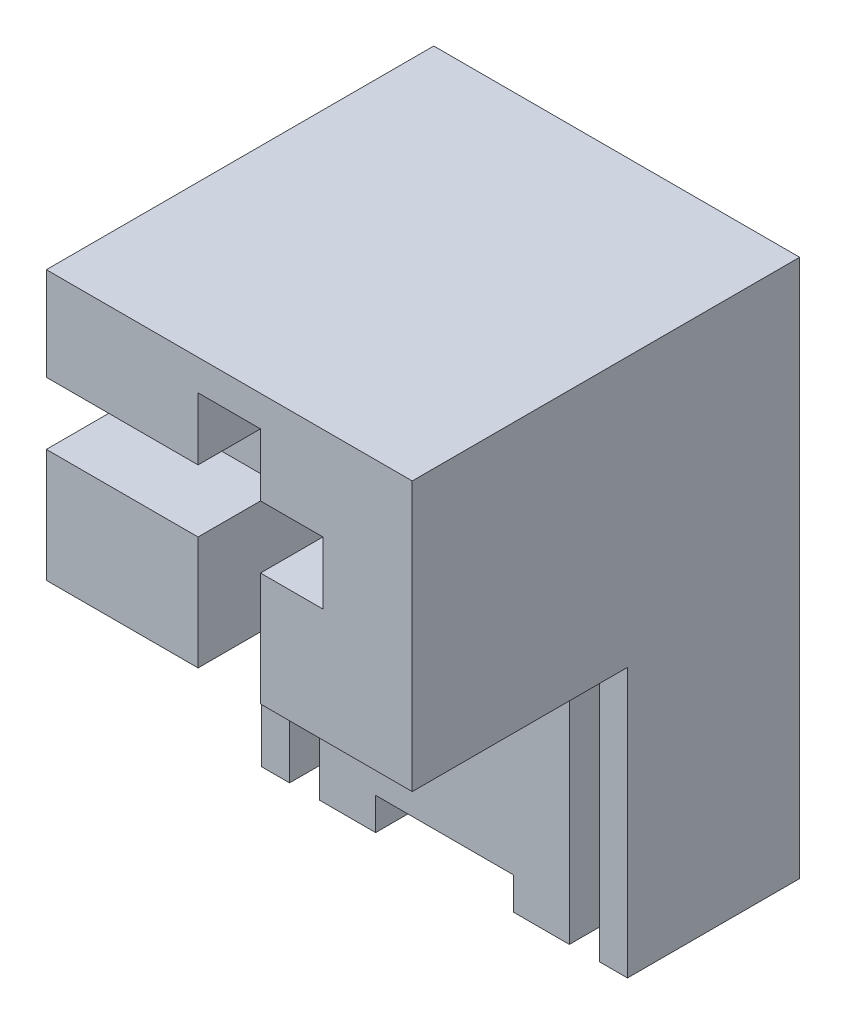
ISO-10303-21;
HEADER;
FILE_DESCRIPTION(('STEP AP214'),'2;1');
FILE_NAME('part.step','',(''),(''),'','','');
FILE_SCHEMA(('AUTOMOTIVE_DESIGN { 1 0 10303 214 1 1 1 1 }'));
ENDSEC;
DATA;
#1=APPLICATION_CONTEXT('core data for automotive mechanical design processes');
#2=APPLICATION_PROTOCOL_DEFINITION('international standard','automotive_design',2000,#1);
#3=PRODUCT_CONTEXT('',#1,'mechanical');
#4=PRODUCT('Part','Part','',(#3));
#5=PRODUCT_RELATED_PRODUCT_CATEGORY('part','',(#4));
#6=PRODUCT_DEFINITION_FORMATION('','',#4);
#7=PRODUCT_DEFINITION_CONTEXT('part definition',#1,'design');
#8=PRODUCT_DEFINITION('design','',#6,#7);
#9=PRODUCT_DEFINITION_SHAPE('','',#8);
#10=(LENGTH_UNIT() NAMED_UNIT(*) SI_UNIT(.MILLI.,.METRE.));
#11=(NAMED_UNIT(*) PLANE_ANGLE_UNIT() SI_UNIT($,.RADIAN.));
#12=(NAMED_UNIT(*) SI_UNIT($,.STERADIAN.) SOLID_ANGLE_UNIT());
#13=UNCERTAINTY_MEASURE_WITH_UNIT(LENGTH_MEASURE(1.E-05),#10,'distance_accuracy_value','');
#14=(GEOMETRIC_REPRESENTATION_CONTEXT(3) GLOBAL_UNCERTAINTY_ASSIGNED_CONTEXT((#13)) GLOBAL_UNIT_ASSIGNED_CONTEXT((#10,
#11,#12)) REPRESENTATION_CONTEXT('',''));
#15=CARTESIAN_POINT('',(0.,0.,0.));
#16=DIRECTION('',(0.,0.,1.));
#17=DIRECTION('',(1.,0.,0.));
#18=AXIS2_PLACEMENT_3D('',#15,#16,#17);
#19=CARTESIAN_POINT('',(0.,0.,90.));
#20=DIRECTION('',(0.,-1.,0.));
#21=DIRECTION('',(1.,0.,0.));
#22=AXIS2_PLACEMENT_3D('',#19,#20,#21);
#23=PLANE('',#22);
#24=DIRECTION('',(1.,0.,0.));
#25=VECTOR('',#24,1.);
#26=CARTESIAN_POINT('',(0.,0.,40.));
#27=LINE('',#26,#25);
#28=CARTESIAN_POINT('',(-29.,0.,40.));
#29=VERTEX_POINT('',#28);
#30=CARTESIAN_POINT('',(-7.24999999999998,0.,40.));
#31=VERTEX_POINT('',#30);
#32=EDGE_CURVE('E437',#29,#31,#27,.T.);
#33=ORIENTED_EDGE('',*,*,#32,.T.);
#34=DIRECTION('',(0.,0.,-1.));
#35=VECTOR('',#34,1.);
#36=CARTESIAN_POINT('',(-7.24999999999999,0.,90.));
#37=LINE('',#36,#35);
#38=CARTESIAN_POINT('',(-7.24999999999999,0.,90.));
#39=VERTEX_POINT('',#38);
#40=EDGE_CURVE('E98',#39,#31,#37,.T.);
#41=ORIENTED_EDGE('',*,*,#40,.F.);
#42=DIRECTION('',(-1.,0.,0.));
#43=VECTOR('',#42,1.);
#44=CARTESIAN_POINT('',(0.,0.,90.));
#45=LINE('',#44,#43);
#46=CARTESIAN_POINT('',(-42.5,0.,90.));
#47=VERTEX_POINT('',#46);
#48=EDGE_CURVE('E357',#39,#47,#45,.T.);
#49=ORIENTED_EDGE('',*,*,#48,.T.);
#50=DIRECTION('',(0.,0.,-1.));
#51=VECTOR('',#50,1.);
#52=CARTESIAN_POINT('',(-42.5,0.,90.));
#53=LINE('',#52,#51);
#54=CARTESIAN_POINT('',(-42.5,0.,40.));
#55=VERTEX_POINT('',#54);
#56=EDGE_CURVE('E91',#47,#55,#53,.T.);
#57=ORIENTED_EDGE('',*,*,#56,.T.);
#58=DIRECTION('',(-1.,0.,0.));
#59=VECTOR('',#58,1.);
#60=CARTESIAN_POINT('',(0.,0.,40.));
#61=LINE('',#60,#59);
#62=CARTESIAN_POINT('',(-36.,0.,40.));
#63=VERTEX_POINT('',#62);
#64=EDGE_CURVE('E373',#63,#55,#61,.T.);
#65=ORIENTED_EDGE('',*,*,#64,.F.);
#66=DIRECTION('',(0.,0.,-1.));
#67=VECTOR('',#66,1.);
#68=CARTESIAN_POINT('',(-36.,0.,40.));
#69=LINE('',#68,#67);
#70=CARTESIAN_POINT('',(-36.,0.,0.));
#71=VERTEX_POINT('',#70);
#72=EDGE_CURVE('E403',#63,#71,#69,.T.);
#73=ORIENTED_EDGE('',*,*,#72,.T.);
#74=DIRECTION('',(-1.,0.,0.));
#75=VECTOR('',#74,1.);
#76=CARTESIAN_POINT('',(0.,0.,0.));
#77=LINE('',#76,#75);
#78=CARTESIAN_POINT('',(-29.,0.,0.));
#79=VERTEX_POINT('',#78);
#80=EDGE_CURVE('E364',#79,#71,#77,.T.);
#81=ORIENTED_EDGE('',*,*,#80,.F.);
#82=DIRECTION('',(0.,0.,-1.));
#83=VECTOR('',#82,1.);
#84=CARTESIAN_POINT('',(-29.,0.,40.));
#85=LINE('',#84,#83);
#86=EDGE_CURVE('E484',#29,#79,#85,.T.);
#87=ORIENTED_EDGE('',*,*,#86,.F.);
#88=EDGE_LOOP('',(#33,#41,#49,#57,#65,#73,#81,#87));
#89=FACE_BOUND('',#88,.T.);
#90=ADVANCED_FACE('F83',(#89),#23,.T.);
#91=DIRECTION('',(0.,0.,-1.));
#92=VECTOR('',#91,1.);
#93=CARTESIAN_POINT('',(7.25000000000001,0.,90.));
#94=LINE('',#93,#92);
#95=CARTESIAN_POINT('',(7.25000000000001,0.,90.));
#96=VERTEX_POINT('',#95);
#97=CARTESIAN_POINT('',(7.25000000000001,0.,40.));
#98=VERTEX_POINT('',#97);
#99=EDGE_CURVE('E320',#96,#98,#94,.T.);
#100=ORIENTED_EDGE('',*,*,#99,.T.);
#101=CARTESIAN_POINT('',(29.,0.,40.));
#102=VERTEX_POINT('',#101);
#103=EDGE_CURVE('E440',#98,#102,#27,.T.);
#104=ORIENTED_EDGE('',*,*,#103,.T.);
#105=DIRECTION('',(0.,0.,-1.));
#106=VECTOR('',#105,1.);
#107=CARTESIAN_POINT('',(29.,0.,40.));
#108=LINE('',#107,#106);
#109=CARTESIAN_POINT('',(29.,0.,0.));
#110=VERTEX_POINT('',#109);
#111=EDGE_CURVE('E458',#102,#110,#108,.T.);
#112=ORIENTED_EDGE('',*,*,#111,.T.);
#113=CARTESIAN_POINT('',(36.,0.,0.));
#114=VERTEX_POINT('',#113);
#115=EDGE_CURVE('E106',#114,#110,#77,.T.);
#116=ORIENTED_EDGE('',*,*,#115,.F.);
#117=DIRECTION('',(0.,0.,-1.));
#118=VECTOR('',#117,1.);
#119=CARTESIAN_POINT('',(36.,0.,40.));
#120=LINE('',#119,#118);
#121=CARTESIAN_POINT('',(36.,0.,40.));
#122=VERTEX_POINT('',#121);
#123=EDGE_CURVE('E425',#122,#114,#120,.T.);
#124=ORIENTED_EDGE('',*,*,#123,.F.);
#125=DIRECTION('',(-1.,0.,0.));
#126=VECTOR('',#125,1.);
#127=CARTESIAN_POINT('',(0.,0.,40.));
#128=LINE('',#127,#126);
#129=CARTESIAN_POINT('',(42.5,0.,40.));
#130=VERTEX_POINT('',#129);
#131=EDGE_CURVE('E406',#130,#122,#128,.T.);
#132=ORIENTED_EDGE('',*,*,#131,.F.);
#133=DIRECTION('',(0.,0.,-1.));
#134=VECTOR('',#133,1.);
#135=CARTESIAN_POINT('',(42.5,0.,90.));
#136=LINE('',#135,#134);
#137=CARTESIAN_POINT('',(42.5,0.,90.));
#138=VERTEX_POINT('',#137);
#139=EDGE_CURVE('E525',#138,#130,#136,.T.);
#140=ORIENTED_EDGE('',*,*,#139,.F.);
#141=DIRECTION('',(-1.,0.,0.));
#142=VECTOR('',#141,1.);
#143=CARTESIAN_POINT('',(0.,0.,90.));
#144=LINE('',#143,#142);
#145=EDGE_CURVE('E514',#138,#96,#144,.T.);
#146=ORIENTED_EDGE('',*,*,#145,.T.);
#147=EDGE_LOOP('',(#100,#104,#112,#116,#124,#132,#140,#146));
#148=FACE_BOUND('',#147,.T.);
#149=ADVANCED_FACE('F609',(#148),#23,.T.);
#150=CARTESIAN_POINT('',(0.,26.349803871416,90.));
#151=DIRECTION('',(0.,1.,0.));
#152=DIRECTION('',(0.,0.,1.));
#153=AXIS2_PLACEMENT_3D('',#150,#151,#152);
#154=PLANE('',#153);
#155=DIRECTION('',(1.,0.,0.));
#156=VECTOR('',#155,1.);
#157=CARTESIAN_POINT('',(0.,26.349803871416,70.));
#158=LINE('',#157,#156);
#159=CARTESIAN_POINT('',(-42.5,26.349803871416,70.));
#160=VERTEX_POINT('',#159);
#161=CARTESIAN_POINT('',(-7.24999999999998,26.349803871416,70.));
#162=VERTEX_POINT('',#161);
#163=EDGE_CURVE('E309',#160,#162,#158,.T.);
#164=ORIENTED_EDGE('',*,*,#163,.F.);
#165=DIRECTION('',(0.,0.,-1.));
#166=VECTOR('',#165,1.);
#167=CARTESIAN_POINT('',(-42.5,26.349803871416,90.));
#168=LINE('',#167,#166);
#169=CARTESIAN_POINT('',(-42.5,26.349803871416,90.));
#170=VERTEX_POINT('',#169);
#171=EDGE_CURVE('E12',#170,#160,#168,.T.);
#172=ORIENTED_EDGE('',*,*,#171,.F.);
#173=DIRECTION('',(1.,0.,0.));
#174=VECTOR('',#173,1.);
#175=CARTESIAN_POINT('',(0.,26.349803871416,90.));
#176=LINE('',#175,#174);
#177=CARTESIAN_POINT('',(-7.24999999999998,26.349803871416,90.));
#178=VERTEX_POINT('',#177);
#179=EDGE_CURVE('E352',#170,#178,#176,.T.);
#180=ORIENTED_EDGE('',*,*,#179,.T.);
#181=DIRECTION('',(0.,0.,-1.));
#182=VECTOR('',#181,1.);
#183=CARTESIAN_POINT('',(-7.24999999999998,26.349803871416,90.));
#184=LINE('',#183,#182);
#185=EDGE_CURVE('E362',#178,#162,#184,.T.);
#186=ORIENTED_EDGE('',*,*,#185,.T.);
#187=EDGE_LOOP('',(#164,#172,#180,#186));
#188=FACE_BOUND('',#187,.T.);
#189=ADVANCED_FACE('F85',(#188),#154,.T.);
#190=CARTESIAN_POINT('',(-42.5,0.,90.));
#191=DIRECTION('',(1.,0.,0.));
#192=DIRECTION('',(0.,0.,-1.));
#193=AXIS2_PLACEMENT_3D('',#190,#191,#192);
#194=PLANE('',#193);
#195=DIRECTION('',(0.,-1.,0.));
#196=VECTOR('',#195,1.);
#197=CARTESIAN_POINT('',(-42.5,0.,0.));
#198=LINE('',#197,#196);
#199=CARTESIAN_POINT('',(-42.5,62.5,0.));
#200=VERTEX_POINT('',#199);
#201=CARTESIAN_POINT('',(-42.5,-62.5,0.));
#202=VERTEX_POINT('',#201);
#203=EDGE_CURVE('E351',#200,#202,#198,.T.);
#204=ORIENTED_EDGE('',*,*,#203,.T.);
#205=DIRECTION('',(0.,0.,-1.));
#206=VECTOR('',#205,1.);
#207=CARTESIAN_POINT('',(-42.5,-62.5,40.));
#208=LINE('',#207,#206);
#209=CARTESIAN_POINT('',(-42.5,-62.5,40.));
#210=VERTEX_POINT('',#209);
#211=EDGE_CURVE('E383',#210,#202,#208,.T.);
#212=ORIENTED_EDGE('',*,*,#211,.F.);
#213=DIRECTION('',(0.,-1.,0.));
#214=VECTOR('',#213,1.);
#215=CARTESIAN_POINT('',(-42.5,0.,40.));
#216=LINE('',#215,#214);
#217=EDGE_CURVE('E381',#55,#210,#216,.T.);
#218=ORIENTED_EDGE('',*,*,#217,.F.);
#219=ORIENTED_EDGE('',*,*,#56,.F.);
#220=DIRECTION('',(0.,-1.,0.));
#221=VECTOR('',#220,1.);
#222=CARTESIAN_POINT('',(-42.5,0.,90.));
#223=LINE('',#222,#221);
#224=EDGE_CURVE('E355',#170,#47,#223,.T.);
#225=ORIENTED_EDGE('',*,*,#224,.F.);
#226=ORIENTED_EDGE('',*,*,#171,.T.);
#227=DIRECTION('',(0.,-1.,0.));
#228=VECTOR('',#227,1.);
#229=CARTESIAN_POINT('',(-42.5,0.,70.));
#230=LINE('',#229,#228);
#231=CARTESIAN_POINT('',(-42.5,40.849803871416,70.));
#232=VERTEX_POINT('',#231);
#233=EDGE_CURVE('E348',#232,#160,#230,.T.);
#234=ORIENTED_EDGE('',*,*,#233,.F.);
#235=DIRECTION('',(0.,0.,-1.));
#236=VECTOR('',#235,1.);
#237=CARTESIAN_POINT('',(-42.5,40.849803871416,90.));
#238=LINE('',#237,#236);
#239=CARTESIAN_POINT('',(-42.5,40.849803871416,90.));
#240=VERTEX_POINT('',#239);
#241=EDGE_CURVE('E330',#240,#232,#238,.T.);
#242=ORIENTED_EDGE('',*,*,#241,.F.);
#243=DIRECTION('',(0.,-1.,0.));
#244=VECTOR('',#243,1.);
#245=CARTESIAN_POINT('',(-42.5,0.,90.));
#246=LINE('',#245,#244);
#247=CARTESIAN_POINT('',(-42.5,62.5,90.));
#248=VERTEX_POINT('',#247);
#249=EDGE_CURVE('E490',#248,#240,#246,.T.);
#250=ORIENTED_EDGE('',*,*,#249,.F.);
#251=DIRECTION('',(0.,0.,-1.));
#252=VECTOR('',#251,1.);
#253=CARTESIAN_POINT('',(-42.5,62.5,90.));
#254=LINE('',#253,#252);
#255=EDGE_CURVE('E325',#248,#200,#254,.T.);
#256=ORIENTED_EDGE('',*,*,#255,.T.);
#257=EDGE_LOOP('',(#204,#212,#218,#219,#225,#226,#234,#242,#250,#256));
#258=FACE_BOUND('',#257,.T.);
#259=ADVANCED_FACE('F378',(#258),#194,.F.);
#260=CARTESIAN_POINT('',(-7.24999999999999,0.,90.));
#261=DIRECTION('',(-1.,0.,0.));
#262=DIRECTION('',(0.,-1.,0.));
#263=AXIS2_PLACEMENT_3D('',#260,#261,#262);
#264=PLANE('',#263);
#265=ORIENTED_EDGE('',*,*,#40,.T.);
#266=DIRECTION('',(0.,1.,0.));
#267=VECTOR('',#266,1.);
#268=CARTESIAN_POINT('',(-7.24999999999998,26.349803871416,40.));
#269=LINE('',#268,#267);
#270=CARTESIAN_POINT('',(-7.24999999999998,26.349803871416,40.));
#271=VERTEX_POINT('',#270);
#272=EDGE_CURVE('E398',#31,#271,#269,.T.);
#273=ORIENTED_EDGE('',*,*,#272,.T.);
#274=DIRECTION('',(0.,0.,1.));
#275=VECTOR('',#274,1.);
#276=CARTESIAN_POINT('',(-7.24999999999998,26.349803871416,9.92406004690646));
#277=LINE('',#276,#275);
#278=EDGE_CURVE('E299',#271,#162,#277,.T.);
#279=ORIENTED_EDGE('',*,*,#278,.T.);
#280=ORIENTED_EDGE('',*,*,#185,.F.);
#281=DIRECTION('',(0.,1.,0.));
#282=VECTOR('',#281,1.);
#283=CARTESIAN_POINT('',(-7.24999999999999,0.,90.));
#284=LINE('',#283,#282);
#285=EDGE_CURVE('E360',#39,#178,#284,.T.);
#286=ORIENTED_EDGE('',*,*,#285,.F.);
#287=EDGE_LOOP('',(#265,#273,#279,#280,#286));
#288=FACE_BOUND('',#287,.T.);
#289=ADVANCED_FACE('F551',(#288),#264,.F.);
#290=CARTESIAN_POINT('',(0.,0.,90.));
#291=DIRECTION('',(0.,0.,1.));
#292=DIRECTION('',(1.,0.,0.));
#293=AXIS2_PLACEMENT_3D('',#290,#291,#292);
#294=PLANE('',#293);
#295=ORIENTED_EDGE('',*,*,#179,.F.);
#296=ORIENTED_EDGE('',*,*,#224,.T.);
#297=ORIENTED_EDGE('',*,*,#48,.F.);
#298=ORIENTED_EDGE('',*,*,#285,.T.);
#299=EDGE_LOOP('',(#295,#296,#297,#298));
#300=FACE_BOUND('',#299,.T.);
#301=ADVANCED_FACE('F652',(#300),#294,.T.);
#302=CARTESIAN_POINT('',(0.,0.,0.));
#303=DIRECTION('',(0.,0.,1.));
#304=DIRECTION('',(1.,0.,0.));
#305=AXIS2_PLACEMENT_3D('',#302,#303,#304);
#306=PLANE('',#305);
#307=DIRECTION('',(0.,-1.,0.));
#308=VECTOR('',#307,1.);
#309=CARTESIAN_POINT('',(29.,0.,0.));
#310=LINE('',#309,#308);
#311=CARTESIAN_POINT('',(29.,-62.5,0.));
#312=VERTEX_POINT('',#311);
#313=EDGE_CURVE('E462',#110,#312,#310,.T.);
#314=ORIENTED_EDGE('',*,*,#313,.T.);
#315=DIRECTION('',(1.,0.,0.));
#316=VECTOR('',#315,1.);
#317=CARTESIAN_POINT('',(0.,-62.5,0.));
#318=LINE('',#317,#316);
#319=CARTESIAN_POINT('',(-29.,-62.5,0.));
#320=VERTEX_POINT('',#319);
#321=EDGE_CURVE('E460',#320,#312,#318,.T.);
#322=ORIENTED_EDGE('',*,*,#321,.F.);
#323=DIRECTION('',(0.,-1.,0.));
#324=VECTOR('',#323,1.);
#325=CARTESIAN_POINT('',(-29.,0.,0.));
#326=LINE('',#325,#324);
#327=EDGE_CURVE('E436',#79,#320,#326,.T.);
#328=ORIENTED_EDGE('',*,*,#327,.F.);
#329=ORIENTED_EDGE('',*,*,#80,.T.);
#330=DIRECTION('',(0.,-1.,0.));
#331=VECTOR('',#330,1.);
#332=CARTESIAN_POINT('',(-36.,0.,0.));
#333=LINE('',#332,#331);
#334=CARTESIAN_POINT('',(-36.,-62.5,0.));
#335=VERTEX_POINT('',#334);
#336=EDGE_CURVE('E394',#71,#335,#333,.T.);
#337=ORIENTED_EDGE('',*,*,#336,.T.);
#338=DIRECTION('',(1.,0.,0.));
#339=VECTOR('',#338,1.);
#340=CARTESIAN_POINT('',(0.,-62.5,0.));
#341=LINE('',#340,#339);
#342=EDGE_CURVE('E397',#202,#335,#341,.T.);
#343=ORIENTED_EDGE('',*,*,#342,.F.);
#344=ORIENTED_EDGE('',*,*,#203,.F.);
#345=DIRECTION('',(-1.,0.,0.));
#346=VECTOR('',#345,1.);
#347=CARTESIAN_POINT('',(0.,62.5,0.));
#348=LINE('',#347,#346);
#349=CARTESIAN_POINT('',(42.5,62.5,0.));
#350=VERTEX_POINT('',#349);
#351=EDGE_CURVE('E486',#350,#200,#348,.T.);
#352=ORIENTED_EDGE('',*,*,#351,.F.);
#353=DIRECTION('',(0.,1.,0.));
#354=VECTOR('',#353,1.);
#355=CARTESIAN_POINT('',(42.5,0.,0.));
#356=LINE('',#355,#354);
#357=CARTESIAN_POINT('',(42.5,-62.5,0.));
#358=VERTEX_POINT('',#357);
#359=EDGE_CURVE('E491',#358,#350,#356,.T.);
#360=ORIENTED_EDGE('',*,*,#359,.F.);
#361=DIRECTION('',(1.,0.,0.));
#362=VECTOR('',#361,1.);
#363=CARTESIAN_POINT('',(0.,-62.5,0.));
#364=LINE('',#363,#362);
#365=CARTESIAN_POINT('',(36.,-62.5,0.));
#366=VERTEX_POINT('',#365);
#367=EDGE_CURVE('E410',#366,#358,#364,.T.);
#368=ORIENTED_EDGE('',*,*,#367,.F.);
#369=DIRECTION('',(0.,-1.,0.));
#370=VECTOR('',#369,1.);
#371=CARTESIAN_POINT('',(36.,0.,0.));
#372=LINE('',#371,#370);
#373=EDGE_CURVE('E405',#114,#366,#372,.T.);
#374=ORIENTED_EDGE('',*,*,#373,.F.);
#375=ORIENTED_EDGE('',*,*,#115,.T.);
#376=EDGE_LOOP('',(#314,#322,#328,#329,#337,#343,#344,#352,#360,#368,#374,#375));
#377=FACE_BOUND('',#376,.T.);
#378=ADVANCED_FACE('F566',(#377),#306,.F.);
#379=CARTESIAN_POINT('',(0.,0.,70.));
#380=DIRECTION('',(0.,0.,1.));
#381=DIRECTION('',(1.,0.,0.));
#382=AXIS2_PLACEMENT_3D('',#379,#380,#381);
#383=PLANE('',#382);
#384=DIRECTION('',(-1.,0.,0.));
#385=VECTOR('',#384,1.);
#386=CARTESIAN_POINT('',(-7.24999999999998,26.349803871416,70.));
#387=LINE('',#386,#385);
#388=CARTESIAN_POINT('',(7.25000000000001,26.349803871416,70.));
#389=VERTEX_POINT('',#388);
#390=EDGE_CURVE('E291',#389,#162,#387,.T.);
#391=ORIENTED_EDGE('',*,*,#390,.F.);
#392=DIRECTION('',(1.,0.,0.));
#393=VECTOR('',#392,1.);
#394=CARTESIAN_POINT('',(0.,26.349803871416,70.));
#395=LINE('',#394,#393);
#396=CARTESIAN_POINT('',(21.75,26.349803871416,70.));
#397=VERTEX_POINT('',#396);
#398=EDGE_CURVE('E307',#389,#397,#395,.T.);
#399=ORIENTED_EDGE('',*,*,#398,.T.);
#400=DIRECTION('',(0.,1.,0.));
#401=VECTOR('',#400,1.);
#402=CARTESIAN_POINT('',(21.75,0.,70.));
#403=LINE('',#402,#401);
#404=CARTESIAN_POINT('',(21.75,40.849803871416,70.));
#405=VERTEX_POINT('',#404);
#406=EDGE_CURVE('E324',#397,#405,#403,.T.);
#407=ORIENTED_EDGE('',*,*,#406,.T.);
#408=DIRECTION('',(-1.,0.,0.));
#409=VECTOR('',#408,1.);
#410=CARTESIAN_POINT('',(0.,40.849803871416,70.));
#411=LINE('',#410,#409);
#412=CARTESIAN_POINT('',(7.25000000000001,40.849803871416,70.));
#413=VERTEX_POINT('',#412);
#414=EDGE_CURVE('E327',#405,#413,#411,.T.);
#415=ORIENTED_EDGE('',*,*,#414,.T.);
#416=DIRECTION('',(0.,1.,0.));
#417=VECTOR('',#416,1.);
#418=CARTESIAN_POINT('',(7.25000000000001,0.,70.));
#419=LINE('',#418,#417);
#420=CARTESIAN_POINT('',(7.25000000000001,55.349803871416,70.));
#421=VERTEX_POINT('',#420);
#422=EDGE_CURVE('E336',#413,#421,#419,.T.);
#423=ORIENTED_EDGE('',*,*,#422,.T.);
#424=DIRECTION('',(-1.,0.,0.));
#425=VECTOR('',#424,1.);
#426=CARTESIAN_POINT('',(0.,55.349803871416,70.));
#427=LINE('',#426,#425);
#428=CARTESIAN_POINT('',(-7.24999999999999,55.349803871416,70.));
#429=VERTEX_POINT('',#428);
#430=EDGE_CURVE('E339',#421,#429,#427,.T.);
#431=ORIENTED_EDGE('',*,*,#430,.T.);
#432=DIRECTION('',(0.,-1.,0.));
#433=VECTOR('',#432,1.);
#434=CARTESIAN_POINT('',(-7.24999999999998,0.,70.));
#435=LINE('',#434,#433);
#436=CARTESIAN_POINT('',(-7.24999999999998,40.849803871416,70.));
#437=VERTEX_POINT('',#436);
#438=EDGE_CURVE('E342',#429,#437,#435,.T.);
#439=ORIENTED_EDGE('',*,*,#438,.T.);
#440=DIRECTION('',(-1.,0.,0.));
#441=VECTOR('',#440,1.);
#442=CARTESIAN_POINT('',(0.,40.849803871416,70.));
#443=LINE('',#442,#441);
#444=EDGE_CURVE('E345',#437,#232,#443,.T.);
#445=ORIENTED_EDGE('',*,*,#444,.T.);
#446=ORIENTED_EDGE('',*,*,#233,.T.);
#447=ORIENTED_EDGE('',*,*,#163,.T.);
#448=EDGE_LOOP('',(#391,#399,#407,#415,#423,#431,#439,#445,#446,#447));
#449=FACE_BOUND('',#448,.T.);
#450=ADVANCED_FACE('F304',(#449),#383,.T.);
#451=CARTESIAN_POINT('',(0.,62.5,90.));
#452=DIRECTION('',(0.,-1.,0.));
#453=DIRECTION('',(0.,0.,-1.));
#454=AXIS2_PLACEMENT_3D('',#451,#452,#453);
#455=PLANE('',#454);
#456=ORIENTED_EDGE('',*,*,#351,.T.);
#457=ORIENTED_EDGE('',*,*,#255,.F.);
#458=DIRECTION('',(-1.,0.,0.));
#459=VECTOR('',#458,1.);
#460=CARTESIAN_POINT('',(0.,62.5,90.));
#461=LINE('',#460,#459);
#462=CARTESIAN_POINT('',(42.5,62.5,90.));
#463=VERTEX_POINT('',#462);
#464=EDGE_CURVE('E487',#463,#248,#461,.T.);
#465=ORIENTED_EDGE('',*,*,#464,.F.);
#466=DIRECTION('',(0.,0.,-1.));
#467=VECTOR('',#466,1.);
#468=CARTESIAN_POINT('',(42.5,62.5,90.));
#469=LINE('',#468,#467);
#470=EDGE_CURVE('E519',#463,#350,#469,.T.);
#471=ORIENTED_EDGE('',*,*,#470,.T.);
#472=EDGE_LOOP('',(#456,#457,#465,#471));
#473=FACE_BOUND('',#472,.T.);
#474=ADVANCED_FACE('F620',(#473),#455,.F.);
#475=CARTESIAN_POINT('',(0.,40.849803871416,90.));
#476=DIRECTION('',(0.,-1.,0.));
#477=DIRECTION('',(1.,0.,0.));
#478=AXIS2_PLACEMENT_3D('',#475,#476,#477);
#479=PLANE('',#478);
#480=ORIENTED_EDGE('',*,*,#241,.T.);
#481=ORIENTED_EDGE('',*,*,#444,.F.);
#482=DIRECTION('',(0.,0.,-1.));
#483=VECTOR('',#482,1.);
#484=CARTESIAN_POINT('',(-7.24999999999998,40.849803871416,90.));
#485=LINE('',#484,#483);
#486=CARTESIAN_POINT('',(-7.24999999999998,40.849803871416,90.));
#487=VERTEX_POINT('',#486);
#488=EDGE_CURVE('E542',#487,#437,#485,.T.);
#489=ORIENTED_EDGE('',*,*,#488,.F.);
#490=DIRECTION('',(-1.,0.,0.));
#491=VECTOR('',#490,1.);
#492=CARTESIAN_POINT('',(0.,40.849803871416,90.));
#493=LINE('',#492,#491);
#494=EDGE_CURVE('E493',#487,#240,#493,.T.);
#495=ORIENTED_EDGE('',*,*,#494,.T.);
#496=EDGE_LOOP('',(#480,#481,#489,#495));
#497=FACE_BOUND('',#496,.T.);
#498=ADVANCED_FACE('F546',(#497),#479,.T.);
#499=CARTESIAN_POINT('',(-7.24999999999998,0.,90.));
#500=DIRECTION('',(1.,0.,0.));
#501=DIRECTION('',(0.,1.,0.));
#502=AXIS2_PLACEMENT_3D('',#499,#500,#501);
#503=PLANE('',#502);
#504=ORIENTED_EDGE('',*,*,#488,.T.);
#505=ORIENTED_EDGE('',*,*,#438,.F.);
#506=DIRECTION('',(0.,0.,-1.));
#507=VECTOR('',#506,1.);
#508=CARTESIAN_POINT('',(-7.24999999999999,55.349803871416,90.));
#509=LINE('',#508,#507);
#510=CARTESIAN_POINT('',(-7.24999999999999,55.349803871416,90.));
#511=VERTEX_POINT('',#510);
#512=EDGE_CURVE('E539',#511,#429,#509,.T.);
#513=ORIENTED_EDGE('',*,*,#512,.F.);
#514=DIRECTION('',(0.,-1.,0.));
#515=VECTOR('',#514,1.);
#516=CARTESIAN_POINT('',(-7.24999999999998,0.,90.));
#517=LINE('',#516,#515);
#518=EDGE_CURVE('E496',#511,#487,#517,.T.);
#519=ORIENTED_EDGE('',*,*,#518,.T.);
#520=EDGE_LOOP('',(#504,#505,#513,#519));
#521=FACE_BOUND('',#520,.T.);
#522=ADVANCED_FACE('F849',(#521),#503,.T.);
#523=CARTESIAN_POINT('',(0.,55.349803871416,90.));
#524=DIRECTION('',(0.,-1.,0.));
#525=DIRECTION('',(1.,0.,0.));
#526=AXIS2_PLACEMENT_3D('',#523,#524,#525);
#527=PLANE('',#526);
#528=ORIENTED_EDGE('',*,*,#512,.T.);
#529=ORIENTED_EDGE('',*,*,#430,.F.);
#530=DIRECTION('',(0.,0.,-1.));
#531=VECTOR('',#530,1.);
#532=CARTESIAN_POINT('',(7.25000000000001,55.349803871416,90.));
#533=LINE('',#532,#531);
#534=CARTESIAN_POINT('',(7.25000000000001,55.349803871416,90.));
#535=VERTEX_POINT('',#534);
#536=EDGE_CURVE('E536',#535,#421,#533,.T.);
#537=ORIENTED_EDGE('',*,*,#536,.F.);
#538=DIRECTION('',(-1.,0.,0.));
#539=VECTOR('',#538,1.);
#540=CARTESIAN_POINT('',(0.,55.349803871416,90.));
#541=LINE('',#540,#539);
#542=EDGE_CURVE('E499',#535,#511,#541,.T.);
#543=ORIENTED_EDGE('',*,*,#542,.T.);
#544=EDGE_LOOP('',(#528,#529,#537,#543));
#545=FACE_BOUND('',#544,.T.);
#546=ADVANCED_FACE('F839',(#545),#527,.T.);
#547=CARTESIAN_POINT('',(7.25000000000001,0.,90.));
#548=DIRECTION('',(-1.,0.,0.));
#549=DIRECTION('',(0.,-1.,0.));
#550=AXIS2_PLACEMENT_3D('',#547,#548,#549);
#551=PLANE('',#550);
#552=ORIENTED_EDGE('',*,*,#536,.T.);
#553=ORIENTED_EDGE('',*,*,#422,.F.);
#554=DIRECTION('',(0.,0.,-1.));
#555=VECTOR('',#554,1.);
#556=CARTESIAN_POINT('',(7.25000000000001,40.849803871416,90.));
#557=LINE('',#556,#555);
#558=CARTESIAN_POINT('',(7.25000000000001,40.849803871416,90.));
#559=VERTEX_POINT('',#558);
#560=EDGE_CURVE('E533',#559,#413,#557,.T.);
#561=ORIENTED_EDGE('',*,*,#560,.F.);
#562=DIRECTION('',(0.,1.,0.));
#563=VECTOR('',#562,1.);
#564=CARTESIAN_POINT('',(7.25000000000001,0.,90.));
#565=LINE('',#564,#563);
#566=EDGE_CURVE('E502',#559,#535,#565,.T.);
#567=ORIENTED_EDGE('',*,*,#566,.T.);
#568=EDGE_LOOP('',(#552,#553,#561,#567));
#569=FACE_BOUND('',#568,.T.);
#570=ADVANCED_FACE('F829',(#569),#551,.T.);
#571=CARTESIAN_POINT('',(0.,40.849803871416,90.));
#572=DIRECTION('',(0.,-1.,0.));
#573=DIRECTION('',(1.,0.,0.));
#574=AXIS2_PLACEMENT_3D('',#571,#572,#573);
#575=PLANE('',#574);
#576=ORIENTED_EDGE('',*,*,#560,.T.);
#577=ORIENTED_EDGE('',*,*,#414,.F.);
#578=DIRECTION('',(0.,0.,-1.));
#579=VECTOR('',#578,1.);
#580=CARTESIAN_POINT('',(21.75,40.849803871416,90.));
#581=LINE('',#580,#579);
#582=CARTESIAN_POINT('',(21.75,40.849803871416,90.));
#583=VERTEX_POINT('',#582);
#584=EDGE_CURVE('E530',#583,#405,#581,.T.);
#585=ORIENTED_EDGE('',*,*,#584,.F.);
#586=DIRECTION('',(-1.,0.,0.));
#587=VECTOR('',#586,1.);
#588=CARTESIAN_POINT('',(0.,40.849803871416,90.));
#589=LINE('',#588,#587);
#590=EDGE_CURVE('E505',#583,#559,#589,.T.);
#591=ORIENTED_EDGE('',*,*,#590,.T.);
#592=EDGE_LOOP('',(#576,#577,#585,#591));
#593=FACE_BOUND('',#592,.T.);
#594=ADVANCED_FACE('F817',(#593),#575,.T.);
#595=CARTESIAN_POINT('',(21.75,0.,90.));
#596=DIRECTION('',(-1.,0.,0.));
#597=DIRECTION('',(0.,-1.,0.));
#598=AXIS2_PLACEMENT_3D('',#595,#596,#597);
#599=PLANE('',#598);
#600=ORIENTED_EDGE('',*,*,#584,.T.);
#601=ORIENTED_EDGE('',*,*,#406,.F.);
#602=DIRECTION('',(0.,0.,-1.));
#603=VECTOR('',#602,1.);
#604=CARTESIAN_POINT('',(21.75,26.349803871416,90.));
#605=LINE('',#604,#603);
#606=CARTESIAN_POINT('',(21.75,26.349803871416,90.));
#607=VERTEX_POINT('',#606);
#608=EDGE_CURVE('E319',#607,#397,#605,.T.);
#609=ORIENTED_EDGE('',*,*,#608,.F.);
#610=DIRECTION('',(0.,1.,0.));
#611=VECTOR('',#610,1.);
#612=CARTESIAN_POINT('',(21.75,0.,90.));
#613=LINE('',#612,#611);
#614=EDGE_CURVE('E508',#607,#583,#613,.T.);
#615=ORIENTED_EDGE('',*,*,#614,.T.);
#616=EDGE_LOOP('',(#600,#601,#609,#615));
#617=FACE_BOUND('',#616,.T.);
#618=ADVANCED_FACE('F812',(#617),#599,.T.);
#619=CARTESIAN_POINT('',(0.,26.349803871416,90.));
#620=DIRECTION('',(0.,1.,0.));
#621=DIRECTION('',(-1.,0.,0.));
#622=AXIS2_PLACEMENT_3D('',#619,#620,#621);
#623=PLANE('',#622);
#624=ORIENTED_EDGE('',*,*,#608,.T.);
#625=ORIENTED_EDGE('',*,*,#398,.F.);
#626=DIRECTION('',(0.,0.,-1.));
#627=VECTOR('',#626,1.);
#628=CARTESIAN_POINT('',(7.25000000000001,26.349803871416,90.));
#629=LINE('',#628,#627);
#630=CARTESIAN_POINT('',(7.25000000000001,26.349803871416,90.));
#631=VERTEX_POINT('',#630);
#632=EDGE_CURVE('E312',#631,#389,#629,.T.);
#633=ORIENTED_EDGE('',*,*,#632,.F.);
#634=DIRECTION('',(1.,0.,0.));
#635=VECTOR('',#634,1.);
#636=CARTESIAN_POINT('',(0.,26.349803871416,90.));
#637=LINE('',#636,#635);
#638=EDGE_CURVE('E511',#631,#607,#637,.T.);
#639=ORIENTED_EDGE('',*,*,#638,.T.);
#640=EDGE_LOOP('',(#624,#625,#633,#639));
#641=FACE_BOUND('',#640,.T.);
#642=ADVANCED_FACE('F323',(#641),#623,.T.);
#643=CARTESIAN_POINT('',(7.25000000000001,0.,90.));
#644=DIRECTION('',(-1.,0.,0.));
#645=DIRECTION('',(0.,-1.,0.));
#646=AXIS2_PLACEMENT_3D('',#643,#644,#645);
#647=PLANE('',#646);
#648=ORIENTED_EDGE('',*,*,#632,.T.);
#649=DIRECTION('',(0.,0.,1.));
#650=VECTOR('',#649,1.);
#651=CARTESIAN_POINT('',(7.25000000000001,26.349803871416,9.92406004690646));
#652=LINE('',#651,#650);
#653=CARTESIAN_POINT('',(7.25000000000001,26.349803871416,40.));
#654=VERTEX_POINT('',#653);
#655=EDGE_CURVE('E287',#654,#389,#652,.T.);
#656=ORIENTED_EDGE('',*,*,#655,.F.);
#657=DIRECTION('',(0.,-1.,0.));
#658=VECTOR('',#657,1.);
#659=CARTESIAN_POINT('',(7.25000000000001,26.349803871416,40.));
#660=LINE('',#659,#658);
#661=EDGE_CURVE('E552',#654,#98,#660,.T.);
#662=ORIENTED_EDGE('',*,*,#661,.T.);
#663=ORIENTED_EDGE('',*,*,#99,.F.);
#664=DIRECTION('',(0.,1.,0.));
#665=VECTOR('',#664,1.);
#666=CARTESIAN_POINT('',(7.25000000000001,0.,90.));
#667=LINE('',#666,#665);
#668=EDGE_CURVE('E315',#96,#631,#667,.T.);
#669=ORIENTED_EDGE('',*,*,#668,.T.);
#670=EDGE_LOOP('',(#648,#656,#662,#663,#669));
#671=FACE_BOUND('',#670,.T.);
#672=ADVANCED_FACE('F313',(#671),#647,.T.);
#673=CARTESIAN_POINT('',(42.5,0.,90.));
#674=DIRECTION('',(-1.,0.,0.));
#675=DIRECTION('',(0.,0.,1.));
#676=AXIS2_PLACEMENT_3D('',#673,#674,#675);
#677=PLANE('',#676);
#678=ORIENTED_EDGE('',*,*,#359,.T.);
#679=ORIENTED_EDGE('',*,*,#470,.F.);
#680=DIRECTION('',(0.,1.,0.));
#681=VECTOR('',#680,1.);
#682=CARTESIAN_POINT('',(42.5,0.,90.));
#683=LINE('',#682,#681);
#684=EDGE_CURVE('E517',#138,#463,#683,.T.);
#685=ORIENTED_EDGE('',*,*,#684,.F.);
#686=ORIENTED_EDGE('',*,*,#139,.T.);
#687=DIRECTION('',(0.,1.,0.));
#688=VECTOR('',#687,1.);
#689=CARTESIAN_POINT('',(42.5,0.,40.));
#690=LINE('',#689,#688);
#691=CARTESIAN_POINT('',(42.5,-62.5,40.));
#692=VERTEX_POINT('',#691);
#693=EDGE_CURVE('E414',#692,#130,#690,.T.);
#694=ORIENTED_EDGE('',*,*,#693,.F.);
#695=DIRECTION('',(0.,0.,-1.));
#696=VECTOR('',#695,1.);
#697=CARTESIAN_POINT('',(42.5,-62.5,40.));
#698=LINE('',#697,#696);
#699=EDGE_CURVE('E416',#692,#358,#698,.T.);
#700=ORIENTED_EDGE('',*,*,#699,.T.);
#701=EDGE_LOOP('',(#678,#679,#685,#686,#694,#700));
#702=FACE_BOUND('',#701,.T.);
#703=ADVANCED_FACE('F616',(#702),#677,.F.);
#704=CARTESIAN_POINT('',(0.,0.,90.));
#705=DIRECTION('',(0.,0.,1.));
#706=DIRECTION('',(1.,0.,0.));
#707=AXIS2_PLACEMENT_3D('',#704,#705,#706);
#708=PLANE('',#707);
#709=ORIENTED_EDGE('',*,*,#464,.T.);
#710=ORIENTED_EDGE('',*,*,#249,.T.);
#711=ORIENTED_EDGE('',*,*,#494,.F.);
#712=ORIENTED_EDGE('',*,*,#518,.F.);
#713=ORIENTED_EDGE('',*,*,#542,.F.);
#714=ORIENTED_EDGE('',*,*,#566,.F.);
#715=ORIENTED_EDGE('',*,*,#590,.F.);
#716=ORIENTED_EDGE('',*,*,#614,.F.);
#717=ORIENTED_EDGE('',*,*,#638,.F.);
#718=ORIENTED_EDGE('',*,*,#668,.F.);
#719=ORIENTED_EDGE('',*,*,#145,.F.);
#720=ORIENTED_EDGE('',*,*,#684,.T.);
#721=EDGE_LOOP('',(#709,#710,#711,#712,#713,#714,#715,#716,#717,#718,#719,#720));
#722=FACE_BOUND('',#721,.T.);
#723=ADVANCED_FACE('F607',(#722),#708,.T.);
#724=CARTESIAN_POINT('',(-29.,0.,40.));
#725=DIRECTION('',(1.,0.,0.));
#726=DIRECTION('',(0.,1.,0.));
#727=AXIS2_PLACEMENT_3D('',#724,#725,#726);
#728=PLANE('',#727);
#729=ORIENTED_EDGE('',*,*,#327,.T.);
#730=DIRECTION('',(0.,0.,-1.));
#731=VECTOR('',#730,1.);
#732=CARTESIAN_POINT('',(-29.,-62.5,40.));
#733=LINE('',#732,#731);
#734=CARTESIAN_POINT('',(-29.,-62.5,40.));
#735=VERTEX_POINT('',#734);
#736=EDGE_CURVE('E481',#735,#320,#733,.T.);
#737=ORIENTED_EDGE('',*,*,#736,.F.);
#738=DIRECTION('',(0.,-1.,0.));
#739=VECTOR('',#738,1.);
#740=CARTESIAN_POINT('',(-29.,0.,40.));
#741=LINE('',#740,#739);
#742=EDGE_CURVE('E439',#29,#735,#741,.T.);
#743=ORIENTED_EDGE('',*,*,#742,.F.);
#744=ORIENTED_EDGE('',*,*,#86,.T.);
#745=EDGE_LOOP('',(#729,#737,#743,#744));
#746=FACE_BOUND('',#745,.T.);
#747=ADVANCED_FACE('F572',(#746),#728,.F.);
#748=CARTESIAN_POINT('',(0.,-62.5,40.));
#749=DIRECTION('',(0.,1.,0.));
#750=DIRECTION('',(0.,0.,1.));
#751=AXIS2_PLACEMENT_3D('',#748,#749,#750);
#752=PLANE('',#751);
#753=ORIENTED_EDGE('',*,*,#321,.T.);
#754=DIRECTION('',(0.,0.,-1.));
#755=VECTOR('',#754,1.);
#756=CARTESIAN_POINT('',(29.,-62.5,40.));
#757=LINE('',#756,#755);
#758=CARTESIAN_POINT('',(29.,-62.5,40.));
#759=VERTEX_POINT('',#758);
#760=EDGE_CURVE('E466',#759,#312,#757,.T.);
#761=ORIENTED_EDGE('',*,*,#760,.F.);
#762=DIRECTION('',(1.,0.,0.));
#763=VECTOR('',#762,1.);
#764=CARTESIAN_POINT('',(0.,-62.5,40.));
#765=LINE('',#764,#763);
#766=CARTESIAN_POINT('',(16.,-62.5,40.));
#767=VERTEX_POINT('',#766);
#768=EDGE_CURVE('E453',#767,#759,#765,.T.);
#769=ORIENTED_EDGE('',*,*,#768,.F.);
#770=DIRECTION('',(0.,0.,-1.));
#771=VECTOR('',#770,1.);
#772=CARTESIAN_POINT('',(16.,-62.5,40.));
#773=LINE('',#772,#771);
#774=CARTESIAN_POINT('',(16.,-62.5,30.));
#775=VERTEX_POINT('',#774);
#776=EDGE_CURVE('E469',#767,#775,#773,.T.);
#777=ORIENTED_EDGE('',*,*,#776,.T.);
#778=DIRECTION('',(1.,0.,0.));
#779=VECTOR('',#778,1.);
#780=CARTESIAN_POINT('',(0.,-62.5,30.));
#781=LINE('',#780,#779);
#782=CARTESIAN_POINT('',(-16.,-62.5,30.));
#783=VERTEX_POINT('',#782);
#784=EDGE_CURVE('E432',#783,#775,#781,.T.);
#785=ORIENTED_EDGE('',*,*,#784,.F.);
#786=DIRECTION('',(0.,0.,-1.));
#787=VECTOR('',#786,1.);
#788=CARTESIAN_POINT('',(-16.,-62.5,40.));
#789=LINE('',#788,#787);
#790=CARTESIAN_POINT('',(-16.,-62.5,40.));
#791=VERTEX_POINT('',#790);
#792=EDGE_CURVE('E478',#791,#783,#789,.T.);
#793=ORIENTED_EDGE('',*,*,#792,.F.);
#794=DIRECTION('',(1.,0.,0.));
#795=VECTOR('',#794,1.);
#796=CARTESIAN_POINT('',(0.,-62.5,40.));
#797=LINE('',#796,#795);
#798=EDGE_CURVE('E442',#735,#791,#797,.T.);
#799=ORIENTED_EDGE('',*,*,#798,.F.);
#800=ORIENTED_EDGE('',*,*,#736,.T.);
#801=EDGE_LOOP('',(#753,#761,#769,#777,#785,#793,#799,#800));
#802=FACE_BOUND('',#801,.T.);
#803=ADVANCED_FACE('F577',(#802),#752,.F.);
#804=CARTESIAN_POINT('',(-16.,0.,40.));
#805=DIRECTION('',(1.,0.,0.));
#806=DIRECTION('',(0.,0.,-1.));
#807=AXIS2_PLACEMENT_3D('',#804,#805,#806);
#808=PLANE('',#807);
#809=DIRECTION('',(0.,-1.,0.));
#810=VECTOR('',#809,1.);
#811=CARTESIAN_POINT('',(-16.,0.,30.));
#812=LINE('',#811,#810);
#813=CARTESIAN_POINT('',(-16.,-55.,30.));
#814=VERTEX_POINT('',#813);
#815=EDGE_CURVE('E430',#814,#783,#812,.T.);
#816=ORIENTED_EDGE('',*,*,#815,.F.);
#817=DIRECTION('',(0.,0.,-1.));
#818=VECTOR('',#817,1.);
#819=CARTESIAN_POINT('',(-16.,-55.,40.));
#820=LINE('',#819,#818);
#821=CARTESIAN_POINT('',(-16.,-55.,40.));
#822=VERTEX_POINT('',#821);
#823=EDGE_CURVE('E475',#822,#814,#820,.T.);
#824=ORIENTED_EDGE('',*,*,#823,.F.);
#825=DIRECTION('',(0.,-1.,0.));
#826=VECTOR('',#825,1.);
#827=CARTESIAN_POINT('',(-16.,0.,40.));
#828=LINE('',#827,#826);
#829=EDGE_CURVE('E444',#822,#791,#828,.T.);
#830=ORIENTED_EDGE('',*,*,#829,.T.);
#831=ORIENTED_EDGE('',*,*,#792,.T.);
#832=EDGE_LOOP('',(#816,#824,#830,#831));
#833=FACE_BOUND('',#832,.T.);
#834=ADVANCED_FACE('F602',(#833),#808,.T.);
#835=CARTESIAN_POINT('',(0.,-55.,40.));
#836=DIRECTION('',(0.,-1.,0.));
#837=DIRECTION('',(0.,0.,-1.));
#838=AXIS2_PLACEMENT_3D('',#835,#836,#837);
#839=PLANE('',#838);
#840=DIRECTION('',(-1.,0.,0.));
#841=VECTOR('',#840,1.);
#842=CARTESIAN_POINT('',(0.,-55.,30.));
#843=LINE('',#842,#841);
#844=CARTESIAN_POINT('',(16.,-55.,30.));
#845=VERTEX_POINT('',#844);
#846=EDGE_CURVE('E428',#845,#814,#843,.T.);
#847=ORIENTED_EDGE('',*,*,#846,.F.);
#848=DIRECTION('',(0.,0.,-1.));
#849=VECTOR('',#848,1.);
#850=CARTESIAN_POINT('',(16.,-55.,40.));
#851=LINE('',#850,#849);
#852=CARTESIAN_POINT('',(16.,-55.,40.));
#853=VERTEX_POINT('',#852);
#854=EDGE_CURVE('E472',#853,#845,#851,.T.);
#855=ORIENTED_EDGE('',*,*,#854,.F.);
#856=DIRECTION('',(-1.,0.,0.));
#857=VECTOR('',#856,1.);
#858=CARTESIAN_POINT('',(0.,-55.,40.));
#859=LINE('',#858,#857);
#860=EDGE_CURVE('E447',#853,#822,#859,.T.);
#861=ORIENTED_EDGE('',*,*,#860,.T.);
#862=ORIENTED_EDGE('',*,*,#823,.T.);
#863=EDGE_LOOP('',(#847,#855,#861,#862));
#864=FACE_BOUND('',#863,.T.);
#865=ADVANCED_FACE('F599',(#864),#839,.T.);
#866=CARTESIAN_POINT('',(16.,0.,40.));
#867=DIRECTION('',(-1.,0.,0.));
#868=DIRECTION('',(0.,0.,1.));
#869=AXIS2_PLACEMENT_3D('',#866,#867,#868);
#870=PLANE('',#869);
#871=DIRECTION('',(0.,1.,0.));
#872=VECTOR('',#871,1.);
#873=CARTESIAN_POINT('',(16.,0.,30.));
#874=LINE('',#873,#872);
#875=EDGE_CURVE('E434',#775,#845,#874,.T.);
#876=ORIENTED_EDGE('',*,*,#875,.F.);
#877=ORIENTED_EDGE('',*,*,#776,.F.);
#878=DIRECTION('',(0.,1.,0.));
#879=VECTOR('',#878,1.);
#880=CARTESIAN_POINT('',(16.,0.,40.));
#881=LINE('',#880,#879);
#882=EDGE_CURVE('E450',#767,#853,#881,.T.);
#883=ORIENTED_EDGE('',*,*,#882,.T.);
#884=ORIENTED_EDGE('',*,*,#854,.T.);
#885=EDGE_LOOP('',(#876,#877,#883,#884));
#886=FACE_BOUND('',#885,.T.);
#887=ADVANCED_FACE('F593',(#886),#870,.T.);
#888=CARTESIAN_POINT('',(29.,0.,40.));
#889=DIRECTION('',(1.,0.,0.));
#890=DIRECTION('',(0.,1.,0.));
#891=AXIS2_PLACEMENT_3D('',#888,#889,#890);
#892=PLANE('',#891);
#893=ORIENTED_EDGE('',*,*,#313,.F.);
#894=ORIENTED_EDGE('',*,*,#111,.F.);
#895=DIRECTION('',(0.,-1.,0.));
#896=VECTOR('',#895,1.);
#897=CARTESIAN_POINT('',(29.,0.,40.));
#898=LINE('',#897,#896);
#899=EDGE_CURVE('E455',#102,#759,#898,.T.);
#900=ORIENTED_EDGE('',*,*,#899,.T.);
#901=ORIENTED_EDGE('',*,*,#760,.T.);
#902=EDGE_LOOP('',(#893,#894,#900,#901));
#903=FACE_BOUND('',#902,.T.);
#904=ADVANCED_FACE('F581',(#903),#892,.T.);
#905=CARTESIAN_POINT('',(0.,0.,40.));
#906=DIRECTION('',(0.,0.,1.));
#907=DIRECTION('',(1.,0.,0.));
#908=AXIS2_PLACEMENT_3D('',#905,#906,#907);
#909=PLANE('',#908);
#910=ORIENTED_EDGE('',*,*,#32,.F.);
#911=ORIENTED_EDGE('',*,*,#742,.T.);
#912=ORIENTED_EDGE('',*,*,#798,.T.);
#913=ORIENTED_EDGE('',*,*,#829,.F.);
#914=ORIENTED_EDGE('',*,*,#860,.F.);
#915=ORIENTED_EDGE('',*,*,#882,.F.);
#916=ORIENTED_EDGE('',*,*,#768,.T.);
#917=ORIENTED_EDGE('',*,*,#899,.F.);
#918=ORIENTED_EDGE('',*,*,#103,.F.);
#919=ORIENTED_EDGE('',*,*,#661,.F.);
#920=DIRECTION('',(1.,0.,0.));
#921=VECTOR('',#920,1.);
#922=CARTESIAN_POINT('',(-7.24999999999998,26.349803871416,40.));
#923=LINE('',#922,#921);
#924=EDGE_CURVE('E294',#271,#654,#923,.T.);
#925=ORIENTED_EDGE('',*,*,#924,.F.);
#926=ORIENTED_EDGE('',*,*,#272,.F.);
#927=EDGE_LOOP('',(#910,#911,#912,#913,#914,#915,#916,#917,#918,#919,#925,#926));
#928=FACE_BOUND('',#927,.T.);
#929=ADVANCED_FACE('F586',(#928),#909,.T.);
#930=CARTESIAN_POINT('',(0.,0.,30.));
#931=DIRECTION('',(0.,0.,1.));
#932=DIRECTION('',(1.,0.,0.));
#933=AXIS2_PLACEMENT_3D('',#930,#931,#932);
#934=PLANE('',#933);
#935=ORIENTED_EDGE('',*,*,#846,.T.);
#936=ORIENTED_EDGE('',*,*,#815,.T.);
#937=ORIENTED_EDGE('',*,*,#784,.T.);
#938=ORIENTED_EDGE('',*,*,#875,.T.);
#939=EDGE_LOOP('',(#935,#936,#937,#938));
#940=FACE_BOUND('',#939,.T.);
#941=ADVANCED_FACE('F596',(#940),#934,.T.);
#942=CARTESIAN_POINT('',(36.,0.,40.));
#943=DIRECTION('',(1.,0.,0.));
#944=DIRECTION('',(0.,1.,0.));
#945=AXIS2_PLACEMENT_3D('',#942,#943,#944);
#946=PLANE('',#945);
#947=ORIENTED_EDGE('',*,*,#373,.T.);
#948=DIRECTION('',(0.,0.,-1.));
#949=VECTOR('',#948,1.);
#950=CARTESIAN_POINT('',(36.,-62.5,40.));
#951=LINE('',#950,#949);
#952=CARTESIAN_POINT('',(36.,-62.5,40.));
#953=VERTEX_POINT('',#952);
#954=EDGE_CURVE('E422',#953,#366,#951,.T.);
#955=ORIENTED_EDGE('',*,*,#954,.F.);
#956=DIRECTION('',(0.,-1.,0.));
#957=VECTOR('',#956,1.);
#958=CARTESIAN_POINT('',(36.,0.,40.));
#959=LINE('',#958,#957);
#960=EDGE_CURVE('E409',#122,#953,#959,.T.);
#961=ORIENTED_EDGE('',*,*,#960,.F.);
#962=ORIENTED_EDGE('',*,*,#123,.T.);
#963=EDGE_LOOP('',(#947,#955,#961,#962));
#964=FACE_BOUND('',#963,.T.);
#965=ADVANCED_FACE('F631',(#964),#946,.F.);
#966=CARTESIAN_POINT('',(0.,-62.5,40.));
#967=DIRECTION('',(0.,1.,0.));
#968=DIRECTION('',(0.,0.,1.));
#969=AXIS2_PLACEMENT_3D('',#966,#967,#968);
#970=PLANE('',#969);
#971=ORIENTED_EDGE('',*,*,#367,.T.);
#972=ORIENTED_EDGE('',*,*,#699,.F.);
#973=DIRECTION('',(1.,0.,0.));
#974=VECTOR('',#973,1.);
#975=CARTESIAN_POINT('',(0.,-62.5,40.));
#976=LINE('',#975,#974);
#977=EDGE_CURVE('E412',#953,#692,#976,.T.);
#978=ORIENTED_EDGE('',*,*,#977,.F.);
#979=ORIENTED_EDGE('',*,*,#954,.T.);
#980=EDGE_LOOP('',(#971,#972,#978,#979));
#981=FACE_BOUND('',#980,.T.);
#982=ADVANCED_FACE('F625',(#981),#970,.F.);
#983=CARTESIAN_POINT('',(0.,0.,40.));
#984=DIRECTION('',(0.,0.,1.));
#985=DIRECTION('',(1.,0.,0.));
#986=AXIS2_PLACEMENT_3D('',#983,#984,#985);
#987=PLANE('',#986);
#988=ORIENTED_EDGE('',*,*,#131,.T.);
#989=ORIENTED_EDGE('',*,*,#960,.T.);
#990=ORIENTED_EDGE('',*,*,#977,.T.);
#991=ORIENTED_EDGE('',*,*,#693,.T.);
#992=EDGE_LOOP('',(#988,#989,#990,#991));
#993=FACE_BOUND('',#992,.T.);
#994=ADVANCED_FACE('F629',(#993),#987,.T.);
#995=CARTESIAN_POINT('',(-36.,0.,40.));
#996=DIRECTION('',(1.,0.,0.));
#997=DIRECTION('',(0.,1.,0.));
#998=AXIS2_PLACEMENT_3D('',#995,#996,#997);
#999=PLANE('',#998);
#1000=ORIENTED_EDGE('',*,*,#336,.F.);
#1001=ORIENTED_EDGE('',*,*,#72,.F.);
#1002=DIRECTION('',(0.,-1.,0.));
#1003=VECTOR('',#1002,1.);
#1004=CARTESIAN_POINT('',(-36.,0.,40.));
#1005=LINE('',#1004,#1003);
#1006=CARTESIAN_POINT('',(-36.,-62.5,40.));
#1007=VERTEX_POINT('',#1006);
#1008=EDGE_CURVE('E390',#63,#1007,#1005,.T.);
#1009=ORIENTED_EDGE('',*,*,#1008,.T.);
#1010=DIRECTION('',(0.,0.,-1.));
#1011=VECTOR('',#1010,1.);
#1012=CARTESIAN_POINT('',(-36.,-62.5,40.));
#1013=LINE('',#1012,#1011);
#1014=EDGE_CURVE('E388',#1007,#335,#1013,.T.);
#1015=ORIENTED_EDGE('',*,*,#1014,.T.);
#1016=EDGE_LOOP('',(#1000,#1001,#1009,#1015));
#1017=FACE_BOUND('',#1016,.T.);
#1018=ADVANCED_FACE('F559',(#1017),#999,.T.);
#1019=CARTESIAN_POINT('',(0.,-62.5,40.));
#1020=DIRECTION('',(0.,1.,0.));
#1021=DIRECTION('',(0.,0.,1.));
#1022=AXIS2_PLACEMENT_3D('',#1019,#1020,#1021);
#1023=PLANE('',#1022);
#1024=ORIENTED_EDGE('',*,*,#342,.T.);
#1025=ORIENTED_EDGE('',*,*,#1014,.F.);
#1026=DIRECTION('',(1.,0.,0.));
#1027=VECTOR('',#1026,1.);
#1028=CARTESIAN_POINT('',(0.,-62.5,40.));
#1029=LINE('',#1028,#1027);
#1030=EDGE_CURVE('E386',#210,#1007,#1029,.T.);
#1031=ORIENTED_EDGE('',*,*,#1030,.F.);
#1032=ORIENTED_EDGE('',*,*,#211,.T.);
#1033=EDGE_LOOP('',(#1024,#1025,#1031,#1032));
#1034=FACE_BOUND('',#1033,.T.);
#1035=ADVANCED_FACE('F563',(#1034),#1023,.F.);
#1036=CARTESIAN_POINT('',(0.,0.,40.));
#1037=DIRECTION('',(0.,0.,1.));
#1038=DIRECTION('',(1.,0.,0.));
#1039=AXIS2_PLACEMENT_3D('',#1036,#1037,#1038);
#1040=PLANE('',#1039);
#1041=ORIENTED_EDGE('',*,*,#1008,.F.);
#1042=ORIENTED_EDGE('',*,*,#64,.T.);
#1043=ORIENTED_EDGE('',*,*,#217,.T.);
#1044=ORIENTED_EDGE('',*,*,#1030,.T.);
#1045=EDGE_LOOP('',(#1041,#1042,#1043,#1044));
#1046=FACE_BOUND('',#1045,.T.);
#1047=ADVANCED_FACE('F561',(#1046),#1040,.T.);
#1048=CARTESIAN_POINT('',(-7.24999999999998,26.349803871416,9.92406004690646));
#1049=DIRECTION('',(0.,1.,0.));
#1050=DIRECTION('',(0.,0.,1.));
#1051=AXIS2_PLACEMENT_3D('',#1048,#1049,#1050);
#1052=PLANE('',#1051);
#1053=ORIENTED_EDGE('',*,*,#924,.T.);
#1054=ORIENTED_EDGE('',*,*,#655,.T.);
#1055=ORIENTED_EDGE('',*,*,#390,.T.);
#1056=ORIENTED_EDGE('',*,*,#278,.F.);
#1057=EDGE_LOOP('',(#1053,#1054,#1055,#1056));
#1058=FACE_BOUND('',#1057,.T.);
#1059=ADVANCED_FACE('F289',(#1058),#1052,.F.);
#1060=CLOSED_SHELL('',(#90,#149,#189,#259,#289,#301,#378,#450,#474,#498,#522,#546,#570,#594,
#618,#642,#672,#703,#723,#747,#803,#834,#865,#887,#904,#929,#941,#965,#982,#994,#1018,#1035,
#1047,#1059));
#1061=MANIFOLD_SOLID_BREP('B2',#1060);
#1062=ADVANCED_BREP_SHAPE_REPRESENTATION('',(#18,#1061),#14);
#1063=SHAPE_DEFINITION_REPRESENTATION(#9,#1062);
ENDSEC;
END-ISO-10303-21;
